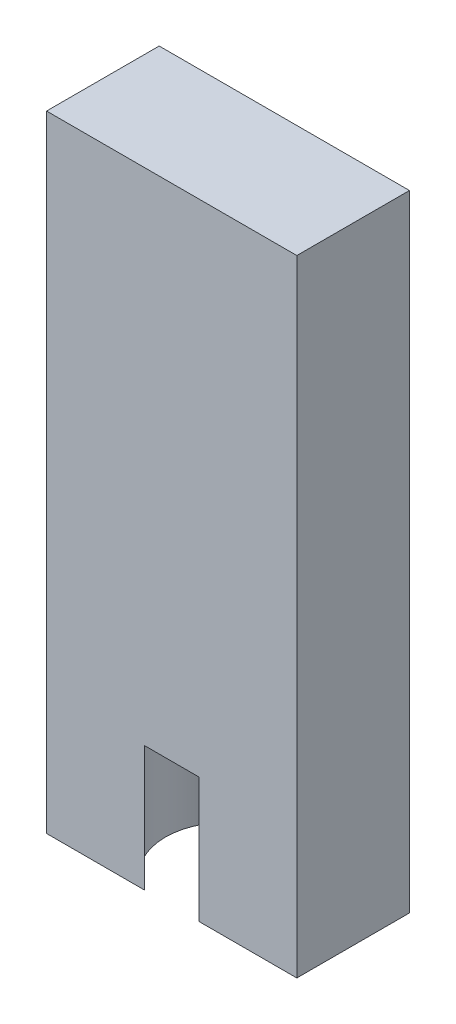
ISO-10303-21;
HEADER;
FILE_DESCRIPTION(('STEP AP214'),'2;1');
FILE_NAME('part.step','',(''),(''),'','','');
FILE_SCHEMA(('AUTOMOTIVE_DESIGN { 1 0 10303 214 1 1 1 1 }'));
ENDSEC;
DATA;
#1=APPLICATION_CONTEXT('core data for automotive mechanical design processes');
#2=APPLICATION_PROTOCOL_DEFINITION('international standard','automotive_design',2000,#1);
#3=PRODUCT_CONTEXT('',#1,'mechanical');
#4=PRODUCT('Part','Part','',(#3));
#5=PRODUCT_RELATED_PRODUCT_CATEGORY('part','',(#4));
#6=PRODUCT_DEFINITION_FORMATION('','',#4);
#7=PRODUCT_DEFINITION_CONTEXT('part definition',#1,'design');
#8=PRODUCT_DEFINITION('design','',#6,#7);
#9=PRODUCT_DEFINITION_SHAPE('','',#8);
#10=(LENGTH_UNIT() NAMED_UNIT(*) SI_UNIT(.MILLI.,.METRE.));
#11=(NAMED_UNIT(*) PLANE_ANGLE_UNIT() SI_UNIT($,.RADIAN.));
#12=(NAMED_UNIT(*) SI_UNIT($,.STERADIAN.) SOLID_ANGLE_UNIT());
#13=UNCERTAINTY_MEASURE_WITH_UNIT(LENGTH_MEASURE(1.E-05),#10,'distance_accuracy_value','');
#14=(GEOMETRIC_REPRESENTATION_CONTEXT(3) GLOBAL_UNCERTAINTY_ASSIGNED_CONTEXT((#13)) GLOBAL_UNIT_ASSIGNED_CONTEXT((#10,
#11,#12)) REPRESENTATION_CONTEXT('',''));
#15=CARTESIAN_POINT('',(0.,0.,0.));
#16=DIRECTION('',(0.,0.,1.));
#17=DIRECTION('',(1.,0.,0.));
#18=AXIS2_PLACEMENT_3D('',#15,#16,#17);
#19=CARTESIAN_POINT('',(0.,0.,0.));
#20=DIRECTION('',(0.,1.,0.));
#21=DIRECTION('',(0.,0.,1.));
#22=AXIS2_PLACEMENT_3D('',#19,#20,#21);
#23=PLANE('',#22);
#24=DIRECTION('',(1.,0.,0.));
#25=VECTOR('',#24,1.);
#26=CARTESIAN_POINT('',(-20.,0.,9.));
#27=LINE('',#26,#25);
#28=CARTESIAN_POINT('',(4.35889894354068,0.,9.));
#29=VERTEX_POINT('',#28);
#30=CARTESIAN_POINT('',(20.,0.,9.));
#31=VERTEX_POINT('',#30);
#32=EDGE_CURVE('E93',#29,#31,#27,.T.);
#33=ORIENTED_EDGE('',*,*,#32,.F.);
#34=CARTESIAN_POINT('',(0.,0.,0.));
#35=DIRECTION('',(0.,-1.,0.));
#36=DIRECTION('',(0.,0.,-1.));
#37=AXIS2_PLACEMENT_3D('',#34,#35,#36);
#38=CIRCLE('',#37,10.);
#39=CARTESIAN_POINT('',(4.35889894354066,0.,-9.00000000000001));
#40=VERTEX_POINT('',#39);
#41=EDGE_CURVE('E205',#40,#29,#38,.T.);
#42=ORIENTED_EDGE('',*,*,#41,.F.);
#43=DIRECTION('',(-1.,0.,0.));
#44=VECTOR('',#43,1.);
#45=CARTESIAN_POINT('',(-20.,0.,-9.00000000000001));
#46=LINE('',#45,#44);
#47=CARTESIAN_POINT('',(20.,0.,-9.00000000000001));
#48=VERTEX_POINT('',#47);
#49=EDGE_CURVE('E145',#48,#40,#46,.T.);
#50=ORIENTED_EDGE('',*,*,#49,.F.);
#51=DIRECTION('',(0.,0.,-1.));
#52=VECTOR('',#51,1.);
#53=CARTESIAN_POINT('',(20.,0.,-9.00000000000001));
#54=LINE('',#53,#52);
#55=EDGE_CURVE('E133',#31,#48,#54,.T.);
#56=ORIENTED_EDGE('',*,*,#55,.F.);
#57=EDGE_LOOP('',(#33,#42,#50,#56));
#58=FACE_BOUND('',#57,.T.);
#59=ADVANCED_FACE('F47',(#58),#23,.F.);
#60=CARTESIAN_POINT('',(20.,100.,-9.00000000000001));
#61=DIRECTION('',(-1.,0.,0.));
#62=DIRECTION('',(0.,0.,1.));
#63=AXIS2_PLACEMENT_3D('',#60,#61,#62);
#64=PLANE('',#63);
#65=ORIENTED_EDGE('',*,*,#55,.T.);
#66=DIRECTION('',(0.,-1.,0.));
#67=VECTOR('',#66,1.);
#68=CARTESIAN_POINT('',(20.,100.,-9.00000000000001));
#69=LINE('',#68,#67);
#70=CARTESIAN_POINT('',(20.,100.,-9.00000000000001));
#71=VERTEX_POINT('',#70);
#72=EDGE_CURVE('E188',#71,#48,#69,.T.);
#73=ORIENTED_EDGE('',*,*,#72,.F.);
#74=DIRECTION('',(0.,0.,-1.));
#75=VECTOR('',#74,1.);
#76=CARTESIAN_POINT('',(20.,100.,-9.00000000000001));
#77=LINE('',#76,#75);
#78=CARTESIAN_POINT('',(20.,100.,9.));
#79=VERTEX_POINT('',#78);
#80=EDGE_CURVE('E154',#79,#71,#77,.T.);
#81=ORIENTED_EDGE('',*,*,#80,.F.);
#82=DIRECTION('',(0.,-1.,0.));
#83=VECTOR('',#82,1.);
#84=CARTESIAN_POINT('',(20.,100.,9.));
#85=LINE('',#84,#83);
#86=EDGE_CURVE('E165',#79,#31,#85,.T.);
#87=ORIENTED_EDGE('',*,*,#86,.T.);
#88=EDGE_LOOP('',(#65,#73,#81,#87));
#89=FACE_BOUND('',#88,.T.);
#90=ADVANCED_FACE('F49',(#89),#64,.F.);
#91=CARTESIAN_POINT('',(-20.,100.,-9.00000000000001));
#92=DIRECTION('',(0.,0.,1.));
#93=DIRECTION('',(1.,0.,0.));
#94=AXIS2_PLACEMENT_3D('',#91,#92,#93);
#95=PLANE('',#94);
#96=DIRECTION('',(1.,0.,0.));
#97=VECTOR('',#96,1.);
#98=CARTESIAN_POINT('',(-20.,20.,-9.00000000000001));
#99=LINE('',#98,#97);
#100=CARTESIAN_POINT('',(-4.35889894354066,20.,-9.00000000000001));
#101=VERTEX_POINT('',#100);
#102=CARTESIAN_POINT('',(4.35889894354066,20.,-9.00000000000001));
#103=VERTEX_POINT('',#102);
#104=EDGE_CURVE('E124',#101,#103,#99,.T.);
#105=ORIENTED_EDGE('',*,*,#104,.F.);
#106=DIRECTION('',(0.,-1.,0.));
#107=VECTOR('',#106,1.);
#108=CARTESIAN_POINT('',(-4.35889894354066,20.,-9.00000000000001));
#109=LINE('',#108,#107);
#110=CARTESIAN_POINT('',(-4.35889894354066,0.,-9.00000000000001));
#111=VERTEX_POINT('',#110);
#112=EDGE_CURVE('E134',#101,#111,#109,.T.);
#113=ORIENTED_EDGE('',*,*,#112,.T.);
#114=CARTESIAN_POINT('',(-20.,0.,-9.00000000000001));
#115=VERTEX_POINT('',#114);
#116=EDGE_CURVE('E169',#111,#115,#46,.T.);
#117=ORIENTED_EDGE('',*,*,#116,.T.);
#118=DIRECTION('',(0.,-1.,0.));
#119=VECTOR('',#118,1.);
#120=CARTESIAN_POINT('',(-20.,100.,-9.00000000000001));
#121=LINE('',#120,#119);
#122=CARTESIAN_POINT('',(-20.,100.,-9.00000000000001));
#123=VERTEX_POINT('',#122);
#124=EDGE_CURVE('E184',#123,#115,#121,.T.);
#125=ORIENTED_EDGE('',*,*,#124,.F.);
#126=DIRECTION('',(-1.,0.,0.));
#127=VECTOR('',#126,1.);
#128=CARTESIAN_POINT('',(-20.,100.,-9.00000000000001));
#129=LINE('',#128,#127);
#130=EDGE_CURVE('E101',#71,#123,#129,.T.);
#131=ORIENTED_EDGE('',*,*,#130,.F.);
#132=ORIENTED_EDGE('',*,*,#72,.T.);
#133=ORIENTED_EDGE('',*,*,#49,.T.);
#134=DIRECTION('',(0.,-1.,0.));
#135=VECTOR('',#134,1.);
#136=CARTESIAN_POINT('',(4.35889894354066,20.,-9.00000000000001));
#137=LINE('',#136,#135);
#138=EDGE_CURVE('E138',#40,#103,#137,.F.);
#139=ORIENTED_EDGE('',*,*,#138,.T.);
#140=EDGE_LOOP('',(#105,#113,#117,#125,#131,#132,#133,#139));
#141=FACE_BOUND('',#140,.T.);
#142=ADVANCED_FACE('F144',(#141),#95,.F.);
#143=CARTESIAN_POINT('',(-20.,100.,-9.00000000000001));
#144=DIRECTION('',(1.,0.,0.));
#145=DIRECTION('',(0.,0.,-1.));
#146=AXIS2_PLACEMENT_3D('',#143,#144,#145);
#147=PLANE('',#146);
#148=DIRECTION('',(0.,0.,1.));
#149=VECTOR('',#148,1.);
#150=CARTESIAN_POINT('',(-20.,0.,-9.00000000000001));
#151=LINE('',#150,#149);
#152=CARTESIAN_POINT('',(-20.,0.,9.));
#153=VERTEX_POINT('',#152);
#154=EDGE_CURVE('E172',#115,#153,#151,.T.);
#155=ORIENTED_EDGE('',*,*,#154,.T.);
#156=DIRECTION('',(0.,-1.,0.));
#157=VECTOR('',#156,1.);
#158=CARTESIAN_POINT('',(-20.,100.,9.));
#159=LINE('',#158,#157);
#160=CARTESIAN_POINT('',(-20.,100.,9.));
#161=VERTEX_POINT('',#160);
#162=EDGE_CURVE('E180',#161,#153,#159,.T.);
#163=ORIENTED_EDGE('',*,*,#162,.F.);
#164=DIRECTION('',(0.,0.,1.));
#165=VECTOR('',#164,1.);
#166=CARTESIAN_POINT('',(-20.,100.,-9.00000000000001));
#167=LINE('',#166,#165);
#168=EDGE_CURVE('E160',#123,#161,#167,.T.);
#169=ORIENTED_EDGE('',*,*,#168,.F.);
#170=ORIENTED_EDGE('',*,*,#124,.T.);
#171=EDGE_LOOP('',(#155,#163,#169,#170));
#172=FACE_BOUND('',#171,.T.);
#173=ADVANCED_FACE('F200',(#172),#147,.F.);
#174=CARTESIAN_POINT('',(-20.,100.,9.));
#175=DIRECTION('',(0.,0.,-1.));
#176=DIRECTION('',(-1.,0.,0.));
#177=AXIS2_PLACEMENT_3D('',#174,#175,#176);
#178=PLANE('',#177);
#179=DIRECTION('',(-1.,0.,0.));
#180=VECTOR('',#179,1.);
#181=CARTESIAN_POINT('',(-20.,20.,9.));
#182=LINE('',#181,#180);
#183=CARTESIAN_POINT('',(4.35889894354068,20.,9.));
#184=VERTEX_POINT('',#183);
#185=CARTESIAN_POINT('',(-4.35889894354068,20.,9.));
#186=VERTEX_POINT('',#185);
#187=EDGE_CURVE('E11',#184,#186,#182,.T.);
#188=ORIENTED_EDGE('',*,*,#187,.F.);
#189=DIRECTION('',(0.,-1.,0.));
#190=VECTOR('',#189,1.);
#191=CARTESIAN_POINT('',(4.35889894354068,20.,9.));
#192=LINE('',#191,#190);
#193=EDGE_CURVE('E140',#184,#29,#192,.T.);
#194=ORIENTED_EDGE('',*,*,#193,.T.);
#195=ORIENTED_EDGE('',*,*,#32,.T.);
#196=ORIENTED_EDGE('',*,*,#86,.F.);
#197=DIRECTION('',(1.,0.,0.));
#198=VECTOR('',#197,1.);
#199=CARTESIAN_POINT('',(-20.,100.,9.));
#200=LINE('',#199,#198);
#201=EDGE_CURVE('E72',#161,#79,#200,.T.);
#202=ORIENTED_EDGE('',*,*,#201,.F.);
#203=ORIENTED_EDGE('',*,*,#162,.T.);
#204=CARTESIAN_POINT('',(-4.35889894354068,0.,9.));
#205=VERTEX_POINT('',#204);
#206=EDGE_CURVE('E157',#153,#205,#27,.T.);
#207=ORIENTED_EDGE('',*,*,#206,.T.);
#208=DIRECTION('',(0.,-1.,0.));
#209=VECTOR('',#208,1.);
#210=CARTESIAN_POINT('',(-4.35889894354068,20.,9.));
#211=LINE('',#210,#209);
#212=EDGE_CURVE('E63',#205,#186,#211,.F.);
#213=ORIENTED_EDGE('',*,*,#212,.T.);
#214=EDGE_LOOP('',(#188,#194,#195,#196,#202,#203,#207,#213));
#215=FACE_BOUND('',#214,.T.);
#216=ADVANCED_FACE('F196',(#215),#178,.F.);
#217=CARTESIAN_POINT('',(0.,100.,0.));
#218=DIRECTION('',(0.,1.,0.));
#219=DIRECTION('',(0.,0.,1.));
#220=AXIS2_PLACEMENT_3D('',#217,#218,#219);
#221=PLANE('',#220);
#222=ORIENTED_EDGE('',*,*,#80,.T.);
#223=ORIENTED_EDGE('',*,*,#130,.T.);
#224=ORIENTED_EDGE('',*,*,#168,.T.);
#225=ORIENTED_EDGE('',*,*,#201,.T.);
#226=EDGE_LOOP('',(#222,#223,#224,#225));
#227=FACE_BOUND('',#226,.T.);
#228=ADVANCED_FACE('F214',(#227),#221,.T.);
#229=ORIENTED_EDGE('',*,*,#116,.F.);
#230=CARTESIAN_POINT('',(0.,0.,0.));
#231=DIRECTION('',(0.,1.,0.));
#232=DIRECTION('',(0.,0.,1.));
#233=AXIS2_PLACEMENT_3D('',#230,#231,#232);
#234=CIRCLE('',#233,10.);
#235=EDGE_CURVE('E56',#111,#205,#234,.T.);
#236=ORIENTED_EDGE('',*,*,#235,.T.);
#237=ORIENTED_EDGE('',*,*,#206,.F.);
#238=ORIENTED_EDGE('',*,*,#154,.F.);
#239=EDGE_LOOP('',(#229,#236,#237,#238));
#240=FACE_BOUND('',#239,.T.);
#241=ADVANCED_FACE('F194',(#240),#23,.F.);
#242=CARTESIAN_POINT('',(0.,20.,0.));
#243=DIRECTION('',(0.,-1.,0.));
#244=DIRECTION('',(0.,0.,-1.));
#245=AXIS2_PLACEMENT_3D('',#242,#243,#244);
#246=PLANE('',#245);
#247=ORIENTED_EDGE('',*,*,#104,.T.);
#248=CARTESIAN_POINT('',(0.,20.,0.));
#249=DIRECTION('',(0.,-1.,0.));
#250=DIRECTION('',(0.,0.,-1.));
#251=AXIS2_PLACEMENT_3D('',#248,#249,#250);
#252=CIRCLE('',#251,10.);
#253=EDGE_CURVE('E127',#103,#184,#252,.T.);
#254=ORIENTED_EDGE('',*,*,#253,.T.);
#255=ORIENTED_EDGE('',*,*,#187,.T.);
#256=EDGE_CURVE('E129',#186,#101,#252,.T.);
#257=ORIENTED_EDGE('',*,*,#256,.T.);
#258=EDGE_LOOP('',(#247,#254,#255,#257));
#259=FACE_BOUND('',#258,.T.);
#260=ADVANCED_FACE('F126',(#259),#246,.T.);
#261=CARTESIAN_POINT('',(0.,20.,0.));
#262=DIRECTION('',(0.,-1.,0.));
#263=DIRECTION('',(0.,0.,-1.));
#264=AXIS2_PLACEMENT_3D('',#261,#262,#263);
#265=CYLINDRICAL_SURFACE('',#264,10.);
#266=ORIENTED_EDGE('',*,*,#256,.F.);
#267=ORIENTED_EDGE('',*,*,#212,.F.);
#268=ORIENTED_EDGE('',*,*,#235,.F.);
#269=ORIENTED_EDGE('',*,*,#112,.F.);
#270=EDGE_LOOP('',(#266,#267,#268,#269));
#271=FACE_BOUND('',#270,.T.);
#272=ADVANCED_FACE('F203',(#271),#265,.F.);
#273=ORIENTED_EDGE('',*,*,#41,.T.);
#274=ORIENTED_EDGE('',*,*,#193,.F.);
#275=ORIENTED_EDGE('',*,*,#253,.F.);
#276=ORIENTED_EDGE('',*,*,#138,.F.);
#277=EDGE_LOOP('',(#273,#274,#275,#276));
#278=FACE_BOUND('',#277,.T.);
#279=ADVANCED_FACE('F137',(#278),#265,.F.);
#280=CLOSED_SHELL('',(#59,#90,#142,#173,#216,#228,#241,#260,#272,#279));
#281=MANIFOLD_SOLID_BREP('B2',#280);
#282=ADVANCED_BREP_SHAPE_REPRESENTATION('',(#18,#281),#14);
#283=SHAPE_DEFINITION_REPRESENTATION(#9,#282);
ENDSEC;
END-ISO-10303-21;
